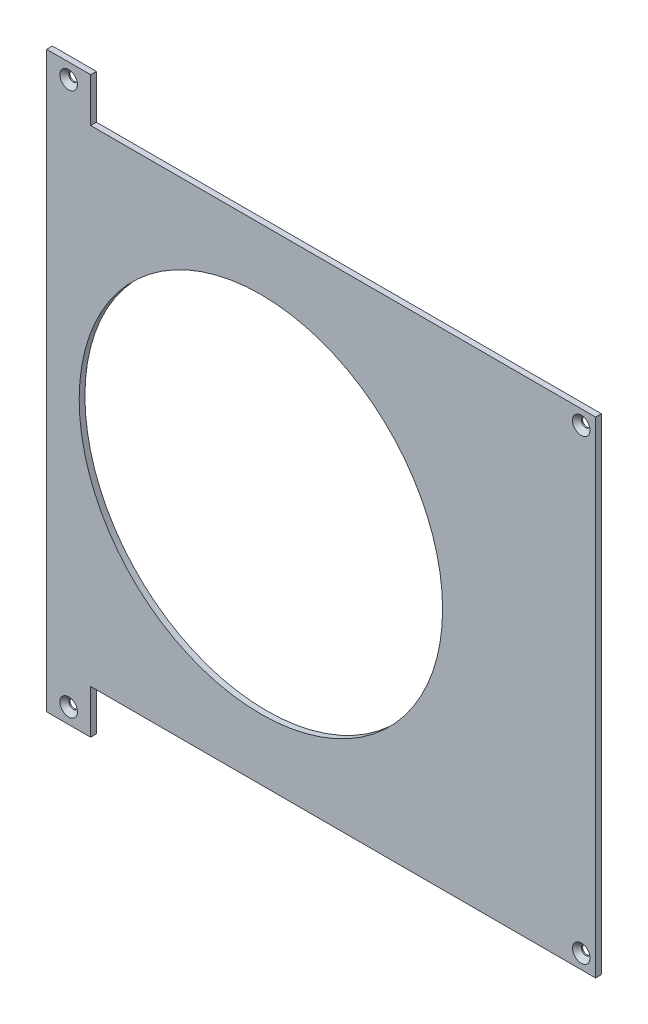
ISO-10303-21;
HEADER;
FILE_DESCRIPTION(('STEP AP214'),'2;1');
FILE_NAME('part.step','',(''),(''),'','','');
FILE_SCHEMA(('AUTOMOTIVE_DESIGN { 1 0 10303 214 1 1 1 1 }'));
ENDSEC;
DATA;
#1=APPLICATION_CONTEXT('core data for automotive mechanical design processes');
#2=APPLICATION_PROTOCOL_DEFINITION('international standard','automotive_design',2000,#1);
#3=PRODUCT_CONTEXT('',#1,'mechanical');
#4=PRODUCT('Part','Part','',(#3));
#5=PRODUCT_RELATED_PRODUCT_CATEGORY('part','',(#4));
#6=PRODUCT_DEFINITION_FORMATION('','',#4);
#7=PRODUCT_DEFINITION_CONTEXT('part definition',#1,'design');
#8=PRODUCT_DEFINITION('design','',#6,#7);
#9=PRODUCT_DEFINITION_SHAPE('','',#8);
#10=(LENGTH_UNIT() NAMED_UNIT(*) SI_UNIT(.MILLI.,.METRE.));
#11=(NAMED_UNIT(*) PLANE_ANGLE_UNIT() SI_UNIT($,.RADIAN.));
#12=(NAMED_UNIT(*) SI_UNIT($,.STERADIAN.) SOLID_ANGLE_UNIT());
#13=UNCERTAINTY_MEASURE_WITH_UNIT(LENGTH_MEASURE(1.E-05),#10,'distance_accuracy_value','');
#14=(GEOMETRIC_REPRESENTATION_CONTEXT(3) GLOBAL_UNCERTAINTY_ASSIGNED_CONTEXT((#13)) GLOBAL_UNIT_ASSIGNED_CONTEXT((#10,
#11,#12)) REPRESENTATION_CONTEXT('',''));
#15=CARTESIAN_POINT('',(0.,0.,0.));
#16=DIRECTION('',(0.,0.,1.));
#17=DIRECTION('',(1.,0.,0.));
#18=AXIS2_PLACEMENT_3D('',#15,#16,#17);
#19=CARTESIAN_POINT('',(38.0007499908043,-23.0000000000001,3.));
#20=DIRECTION('',(-1.,0.,0.));
#21=DIRECTION('',(0.,0.,1.));
#22=AXIS2_PLACEMENT_3D('',#19,#20,#21);
#23=PLANE('',#22);
#24=DIRECTION('',(0.,1.,0.));
#25=VECTOR('',#24,1.);
#26=CARTESIAN_POINT('',(38.0007499908043,-23.0000000000001,0.));
#27=LINE('',#26,#25);
#28=CARTESIAN_POINT('',(38.0007499908043,-23.0000000000001,0.));
#29=VERTEX_POINT('',#28);
#30=CARTESIAN_POINT('',(38.0007499908043,0.,0.));
#31=VERTEX_POINT('',#30);
#32=EDGE_CURVE('E148',#29,#31,#27,.T.);
#33=ORIENTED_EDGE('',*,*,#32,.T.);
#34=DIRECTION('',(0.,0.,-1.));
#35=VECTOR('',#34,1.);
#36=CARTESIAN_POINT('',(38.0007499908043,0.,3.));
#37=LINE('',#36,#35);
#38=CARTESIAN_POINT('',(38.0007499908043,0.,3.));
#39=VERTEX_POINT('',#38);
#40=EDGE_CURVE('E11',#39,#31,#37,.T.);
#41=ORIENTED_EDGE('',*,*,#40,.F.);
#42=DIRECTION('',(0.,1.,0.));
#43=VECTOR('',#42,1.);
#44=CARTESIAN_POINT('',(38.0007499908043,-23.0000000000001,3.));
#45=LINE('',#44,#43);
#46=CARTESIAN_POINT('',(38.0007499908043,-23.0000000000001,3.));
#47=VERTEX_POINT('',#46);
#48=EDGE_CURVE('E174',#47,#39,#45,.T.);
#49=ORIENTED_EDGE('',*,*,#48,.F.);
#50=DIRECTION('',(0.,0.,-1.));
#51=VECTOR('',#50,1.);
#52=CARTESIAN_POINT('',(38.0007499908043,-23.0000000000001,3.));
#53=LINE('',#52,#51);
#54=EDGE_CURVE('E61',#47,#29,#53,.T.);
#55=ORIENTED_EDGE('',*,*,#54,.T.);
#56=EDGE_LOOP('',(#33,#41,#49,#55));
#57=FACE_BOUND('',#56,.T.);
#58=ADVANCED_FACE('F43',(#57),#23,.F.);
#59=CARTESIAN_POINT('',(38.0007499908043,0.,3.));
#60=DIRECTION('',(0.,-1.,0.));
#61=DIRECTION('',(1.,0.,0.));
#62=AXIS2_PLACEMENT_3D('',#59,#60,#61);
#63=PLANE('',#62);
#64=DIRECTION('',(-1.,0.,0.));
#65=VECTOR('',#64,1.);
#66=CARTESIAN_POINT('',(38.0007499908043,0.,0.));
#67=LINE('',#66,#65);
#68=CARTESIAN_POINT('',(15.0007499908043,0.,0.));
#69=VERTEX_POINT('',#68);
#70=EDGE_CURVE('E151',#31,#69,#67,.T.);
#71=ORIENTED_EDGE('',*,*,#70,.T.);
#72=DIRECTION('',(0.,0.,-1.));
#73=VECTOR('',#72,1.);
#74=CARTESIAN_POINT('',(15.0007499908043,0.,3.));
#75=LINE('',#74,#73);
#76=CARTESIAN_POINT('',(15.0007499908043,0.,3.));
#77=VERTEX_POINT('',#76);
#78=EDGE_CURVE('E53',#77,#69,#75,.T.);
#79=ORIENTED_EDGE('',*,*,#78,.F.);
#80=DIRECTION('',(-1.,0.,0.));
#81=VECTOR('',#80,1.);
#82=CARTESIAN_POINT('',(38.0007499908043,0.,3.));
#83=LINE('',#82,#81);
#84=EDGE_CURVE('E100',#39,#77,#83,.T.);
#85=ORIENTED_EDGE('',*,*,#84,.F.);
#86=ORIENTED_EDGE('',*,*,#40,.T.);
#87=EDGE_LOOP('',(#71,#79,#85,#86));
#88=FACE_BOUND('',#87,.T.);
#89=ADVANCED_FACE('F219',(#88),#63,.F.);
#90=CARTESIAN_POINT('',(15.0007499908043,0.,3.));
#91=DIRECTION('',(1.,0.,0.));
#92=DIRECTION('',(0.,0.,-1.));
#93=AXIS2_PLACEMENT_3D('',#90,#91,#92);
#94=PLANE('',#93);
#95=DIRECTION('',(0.,-1.,0.));
#96=VECTOR('',#95,1.);
#97=CARTESIAN_POINT('',(15.0007499908043,0.,0.));
#98=LINE('',#97,#96);
#99=CARTESIAN_POINT('',(15.0007499908043,-300.,0.));
#100=VERTEX_POINT('',#99);
#101=EDGE_CURVE('E155',#69,#100,#98,.T.);
#102=ORIENTED_EDGE('',*,*,#101,.T.);
#103=DIRECTION('',(0.,0.,-1.));
#104=VECTOR('',#103,1.);
#105=CARTESIAN_POINT('',(15.0007499908043,-300.,3.));
#106=LINE('',#105,#104);
#107=CARTESIAN_POINT('',(15.0007499908043,-300.,3.));
#108=VERTEX_POINT('',#107);
#109=EDGE_CURVE('E185',#108,#100,#106,.T.);
#110=ORIENTED_EDGE('',*,*,#109,.F.);
#111=DIRECTION('',(0.,-1.,0.));
#112=VECTOR('',#111,1.);
#113=CARTESIAN_POINT('',(15.0007499908043,0.,3.));
#114=LINE('',#113,#112);
#115=EDGE_CURVE('E196',#77,#108,#114,.T.);
#116=ORIENTED_EDGE('',*,*,#115,.F.);
#117=ORIENTED_EDGE('',*,*,#78,.T.);
#118=EDGE_LOOP('',(#102,#110,#116,#117));
#119=FACE_BOUND('',#118,.T.);
#120=ADVANCED_FACE('F194',(#119),#94,.F.);
#121=CARTESIAN_POINT('',(15.0007499908043,-300.,3.));
#122=DIRECTION('',(0.,1.,0.));
#123=DIRECTION('',(0.,0.,1.));
#124=AXIS2_PLACEMENT_3D('',#121,#122,#123);
#125=PLANE('',#124);
#126=DIRECTION('',(1.,0.,0.));
#127=VECTOR('',#126,1.);
#128=CARTESIAN_POINT('',(15.0007499908043,-300.,0.));
#129=LINE('',#128,#127);
#130=CARTESIAN_POINT('',(38.0007499908043,-300.,0.));
#131=VERTEX_POINT('',#130);
#132=EDGE_CURVE('E158',#100,#131,#129,.T.);
#133=ORIENTED_EDGE('',*,*,#132,.T.);
#134=DIRECTION('',(0.,0.,-1.));
#135=VECTOR('',#134,1.);
#136=CARTESIAN_POINT('',(38.0007499908043,-300.,3.));
#137=LINE('',#136,#135);
#138=CARTESIAN_POINT('',(38.0007499908043,-300.,3.));
#139=VERTEX_POINT('',#138);
#140=EDGE_CURVE('E181',#139,#131,#137,.T.);
#141=ORIENTED_EDGE('',*,*,#140,.F.);
#142=DIRECTION('',(1.,0.,0.));
#143=VECTOR('',#142,1.);
#144=CARTESIAN_POINT('',(15.0007499908043,-300.,3.));
#145=LINE('',#144,#143);
#146=EDGE_CURVE('E142',#108,#139,#145,.T.);
#147=ORIENTED_EDGE('',*,*,#146,.F.);
#148=ORIENTED_EDGE('',*,*,#109,.T.);
#149=EDGE_LOOP('',(#133,#141,#147,#148));
#150=FACE_BOUND('',#149,.T.);
#151=ADVANCED_FACE('F203',(#150),#125,.F.);
#152=CARTESIAN_POINT('',(38.0007499908043,-300.,3.));
#153=DIRECTION('',(-1.,0.,0.));
#154=DIRECTION('',(0.,0.,1.));
#155=AXIS2_PLACEMENT_3D('',#152,#153,#154);
#156=PLANE('',#155);
#157=DIRECTION('',(0.,1.,0.));
#158=VECTOR('',#157,1.);
#159=CARTESIAN_POINT('',(38.0007499908043,-300.,0.));
#160=LINE('',#159,#158);
#161=CARTESIAN_POINT('',(38.0007499908043,-277.,0.));
#162=VERTEX_POINT('',#161);
#163=EDGE_CURVE('E161',#131,#162,#160,.T.);
#164=ORIENTED_EDGE('',*,*,#163,.T.);
#165=DIRECTION('',(0.,0.,-1.));
#166=VECTOR('',#165,1.);
#167=CARTESIAN_POINT('',(38.0007499908043,-277.,3.));
#168=LINE('',#167,#166);
#169=CARTESIAN_POINT('',(38.0007499908043,-277.,3.));
#170=VERTEX_POINT('',#169);
#171=EDGE_CURVE('E126',#170,#162,#168,.T.);
#172=ORIENTED_EDGE('',*,*,#171,.F.);
#173=DIRECTION('',(0.,1.,0.));
#174=VECTOR('',#173,1.);
#175=CARTESIAN_POINT('',(38.0007499908043,-300.,3.));
#176=LINE('',#175,#174);
#177=EDGE_CURVE('E137',#139,#170,#176,.T.);
#178=ORIENTED_EDGE('',*,*,#177,.F.);
#179=ORIENTED_EDGE('',*,*,#140,.T.);
#180=EDGE_LOOP('',(#164,#172,#178,#179));
#181=FACE_BOUND('',#180,.T.);
#182=ADVANCED_FACE('F206',(#181),#156,.F.);
#183=CARTESIAN_POINT('',(302.000749990804,-277.,3.));
#184=DIRECTION('',(0.,-1.,0.));
#185=DIRECTION('',(0.,0.,-1.));
#186=AXIS2_PLACEMENT_3D('',#183,#184,#185);
#187=PLANE('',#186);
#188=DIRECTION('',(-1.,0.,0.));
#189=VECTOR('',#188,1.);
#190=CARTESIAN_POINT('',(302.000749990804,-277.,0.));
#191=LINE('',#190,#189);
#192=CARTESIAN_POINT('',(302.000749990804,-277.,0.));
#193=VERTEX_POINT('',#192);
#194=EDGE_CURVE('E122',#193,#162,#191,.T.);
#195=ORIENTED_EDGE('',*,*,#194,.F.);
#196=DIRECTION('',(0.,0.,-1.));
#197=VECTOR('',#196,1.);
#198=CARTESIAN_POINT('',(302.000749990804,-277.,3.));
#199=LINE('',#198,#197);
#200=CARTESIAN_POINT('',(302.000749990804,-277.,3.));
#201=VERTEX_POINT('',#200);
#202=EDGE_CURVE('E116',#201,#193,#199,.T.);
#203=ORIENTED_EDGE('',*,*,#202,.F.);
#204=DIRECTION('',(-1.,0.,0.));
#205=VECTOR('',#204,1.);
#206=CARTESIAN_POINT('',(302.000749990804,-277.,3.));
#207=LINE('',#206,#205);
#208=EDGE_CURVE('E120',#201,#170,#207,.T.);
#209=ORIENTED_EDGE('',*,*,#208,.T.);
#210=ORIENTED_EDGE('',*,*,#171,.T.);
#211=EDGE_LOOP('',(#195,#203,#209,#210));
#212=FACE_BOUND('',#211,.T.);
#213=ADVANCED_FACE('F118',(#212),#187,.T.);
#214=CARTESIAN_POINT('',(302.000749990804,-277.,3.));
#215=DIRECTION('',(-1.,0.,0.));
#216=DIRECTION('',(0.,0.,1.));
#217=AXIS2_PLACEMENT_3D('',#214,#215,#216);
#218=PLANE('',#217);
#219=DIRECTION('',(0.,1.,0.));
#220=VECTOR('',#219,1.);
#221=CARTESIAN_POINT('',(302.000749990804,-277.,0.));
#222=LINE('',#221,#220);
#223=CARTESIAN_POINT('',(302.000749990804,-23.0000000000001,0.));
#224=VERTEX_POINT('',#223);
#225=EDGE_CURVE('E167',#193,#224,#222,.T.);
#226=ORIENTED_EDGE('',*,*,#225,.T.);
#227=DIRECTION('',(0.,0.,-1.));
#228=VECTOR('',#227,1.);
#229=CARTESIAN_POINT('',(302.000749990804,-23.0000000000001,3.));
#230=LINE('',#229,#228);
#231=CARTESIAN_POINT('',(302.000749990804,-23.0000000000001,3.));
#232=VERTEX_POINT('',#231);
#233=EDGE_CURVE('E88',#232,#224,#230,.T.);
#234=ORIENTED_EDGE('',*,*,#233,.F.);
#235=DIRECTION('',(0.,1.,0.));
#236=VECTOR('',#235,1.);
#237=CARTESIAN_POINT('',(302.000749990804,-277.,3.));
#238=LINE('',#237,#236);
#239=EDGE_CURVE('E128',#201,#232,#238,.T.);
#240=ORIENTED_EDGE('',*,*,#239,.F.);
#241=ORIENTED_EDGE('',*,*,#202,.T.);
#242=EDGE_LOOP('',(#226,#234,#240,#241));
#243=FACE_BOUND('',#242,.T.);
#244=ADVANCED_FACE('F129',(#243),#218,.F.);
#245=CARTESIAN_POINT('',(38.0007499908043,-23.0000000000001,3.));
#246=DIRECTION('',(0.,1.,0.));
#247=DIRECTION('',(-1.,0.,0.));
#248=AXIS2_PLACEMENT_3D('',#245,#246,#247);
#249=PLANE('',#248);
#250=DIRECTION('',(1.,0.,0.));
#251=VECTOR('',#250,1.);
#252=CARTESIAN_POINT('',(38.0007499908043,-23.0000000000001,0.));
#253=LINE('',#252,#251);
#254=EDGE_CURVE('E170',#29,#224,#253,.T.);
#255=ORIENTED_EDGE('',*,*,#254,.F.);
#256=ORIENTED_EDGE('',*,*,#54,.F.);
#257=DIRECTION('',(1.,0.,0.));
#258=VECTOR('',#257,1.);
#259=CARTESIAN_POINT('',(38.0007499908043,-23.0000000000001,3.));
#260=LINE('',#259,#258);
#261=EDGE_CURVE('E133',#47,#232,#260,.T.);
#262=ORIENTED_EDGE('',*,*,#261,.T.);
#263=ORIENTED_EDGE('',*,*,#233,.T.);
#264=EDGE_LOOP('',(#255,#256,#262,#263));
#265=FACE_BOUND('',#264,.T.);
#266=ADVANCED_FACE('F207',(#265),#249,.T.);
#267=CARTESIAN_POINT('',(0.,0.,3.));
#268=DIRECTION('',(0.,0.,1.));
#269=DIRECTION('',(1.,0.,0.));
#270=AXIS2_PLACEMENT_3D('',#267,#268,#269);
#271=PLANE('',#270);
#272=CARTESIAN_POINT('',(127.000749990804,-150.,3.));
#273=DIRECTION('',(0.,0.,1.));
#274=DIRECTION('',(1.,0.,0.));
#275=AXIS2_PLACEMENT_3D('',#272,#273,#274);
#276=CIRCLE('',#275,95.);
#277=CARTESIAN_POINT('',(222.000749990804,-150.,3.));
#278=VERTEX_POINT('',#277);
#279=EDGE_CURVE('E279',#278,#278,#276,.T.);
#280=ORIENTED_EDGE('',*,*,#279,.F.);
#281=EDGE_LOOP('',(#280));
#282=FACE_BOUND('',#281,.T.);
#283=CARTESIAN_POINT('',(26.5007499908043,-8.00000000000006,3.));
#284=DIRECTION('',(0.,0.,1.));
#285=DIRECTION('',(1.,0.,0.));
#286=AXIS2_PLACEMENT_3D('',#283,#284,#285);
#287=CIRCLE('',#286,4.59);
#288=CARTESIAN_POINT('',(31.0907499908043,-8.00000000000006,3.));
#289=VERTEX_POINT('',#288);
#290=EDGE_CURVE('E275',#289,#289,#287,.T.);
#291=ORIENTED_EDGE('',*,*,#290,.F.);
#292=EDGE_LOOP('',(#291));
#293=FACE_BOUND('',#292,.T.);
#294=CARTESIAN_POINT('',(26.5007499908043,-292.,3.));
#295=DIRECTION('',(0.,0.,1.));
#296=DIRECTION('',(1.,0.,0.));
#297=AXIS2_PLACEMENT_3D('',#294,#295,#296);
#298=CIRCLE('',#297,4.59);
#299=CARTESIAN_POINT('',(31.0907499908043,-292.,3.));
#300=VERTEX_POINT('',#299);
#301=EDGE_CURVE('E263',#300,#300,#298,.T.);
#302=ORIENTED_EDGE('',*,*,#301,.F.);
#303=EDGE_LOOP('',(#302));
#304=FACE_BOUND('',#303,.T.);
#305=CARTESIAN_POINT('',(294.500749990804,-30.5000000000001,3.));
#306=DIRECTION('',(0.,0.,1.));
#307=DIRECTION('',(1.,0.,0.));
#308=AXIS2_PLACEMENT_3D('',#305,#306,#307);
#309=CIRCLE('',#308,4.58999999999998);
#310=CARTESIAN_POINT('',(299.090749990804,-30.5000000000001,3.));
#311=VERTEX_POINT('',#310);
#312=EDGE_CURVE('E251',#311,#311,#309,.T.);
#313=ORIENTED_EDGE('',*,*,#312,.F.);
#314=EDGE_LOOP('',(#313));
#315=FACE_BOUND('',#314,.T.);
#316=CARTESIAN_POINT('',(294.500749990804,-269.5,3.));
#317=DIRECTION('',(0.,0.,1.));
#318=DIRECTION('',(1.,0.,0.));
#319=AXIS2_PLACEMENT_3D('',#316,#317,#318);
#320=CIRCLE('',#319,4.58999999999998);
#321=CARTESIAN_POINT('',(299.090749990804,-269.5,3.));
#322=VERTEX_POINT('',#321);
#323=EDGE_CURVE('E239',#322,#322,#320,.T.);
#324=ORIENTED_EDGE('',*,*,#323,.F.);
#325=EDGE_LOOP('',(#324));
#326=FACE_BOUND('',#325,.T.);
#327=ORIENTED_EDGE('',*,*,#48,.T.);
#328=ORIENTED_EDGE('',*,*,#84,.T.);
#329=ORIENTED_EDGE('',*,*,#115,.T.);
#330=ORIENTED_EDGE('',*,*,#146,.T.);
#331=ORIENTED_EDGE('',*,*,#177,.T.);
#332=ORIENTED_EDGE('',*,*,#208,.F.);
#333=ORIENTED_EDGE('',*,*,#239,.T.);
#334=ORIENTED_EDGE('',*,*,#261,.F.);
#335=EDGE_LOOP('',(#327,#328,#329,#330,#331,#332,#333,#334));
#336=FACE_BOUND('',#335,.T.);
#337=ADVANCED_FACE('F135',(#282,#293,#304,#315,#326,#336),#271,.T.);
#338=CARTESIAN_POINT('',(0.,0.,0.));
#339=DIRECTION('',(0.,0.,1.));
#340=DIRECTION('',(1.,0.,0.));
#341=AXIS2_PLACEMENT_3D('',#338,#339,#340);
#342=PLANE('',#341);
#343=CARTESIAN_POINT('',(127.000749990804,-150.,0.));
#344=DIRECTION('',(0.,0.,1.));
#345=DIRECTION('',(1.,0.,0.));
#346=AXIS2_PLACEMENT_3D('',#343,#344,#345);
#347=CIRCLE('',#346,95.);
#348=CARTESIAN_POINT('',(222.000749990804,-150.,0.));
#349=VERTEX_POINT('',#348);
#350=EDGE_CURVE('E46',#349,#349,#347,.T.);
#351=ORIENTED_EDGE('',*,*,#350,.T.);
#352=EDGE_LOOP('',(#351));
#353=FACE_BOUND('',#352,.T.);
#354=CARTESIAN_POINT('',(26.5007499908043,-8.00000000000006,0.));
#355=DIRECTION('',(0.,0.,1.));
#356=DIRECTION('',(1.,0.,0.));
#357=AXIS2_PLACEMENT_3D('',#354,#355,#356);
#358=CIRCLE('',#357,2.25);
#359=CARTESIAN_POINT('',(28.7507499908043,-8.00000000000006,0.));
#360=VERTEX_POINT('',#359);
#361=EDGE_CURVE('E267',#360,#360,#358,.T.);
#362=ORIENTED_EDGE('',*,*,#361,.T.);
#363=EDGE_LOOP('',(#362));
#364=FACE_BOUND('',#363,.T.);
#365=CARTESIAN_POINT('',(26.5007499908043,-292.,0.));
#366=DIRECTION('',(0.,0.,1.));
#367=DIRECTION('',(1.,0.,0.));
#368=AXIS2_PLACEMENT_3D('',#365,#366,#367);
#369=CIRCLE('',#368,2.25);
#370=CARTESIAN_POINT('',(28.7507499908043,-292.,0.));
#371=VERTEX_POINT('',#370);
#372=EDGE_CURVE('E255',#371,#371,#369,.T.);
#373=ORIENTED_EDGE('',*,*,#372,.T.);
#374=EDGE_LOOP('',(#373));
#375=FACE_BOUND('',#374,.T.);
#376=CARTESIAN_POINT('',(294.500749990804,-30.5000000000001,0.));
#377=DIRECTION('',(0.,0.,1.));
#378=DIRECTION('',(1.,0.,0.));
#379=AXIS2_PLACEMENT_3D('',#376,#377,#378);
#380=CIRCLE('',#379,2.24999999999997);
#381=CARTESIAN_POINT('',(296.750749990804,-30.5000000000001,0.));
#382=VERTEX_POINT('',#381);
#383=EDGE_CURVE('E243',#382,#382,#380,.T.);
#384=ORIENTED_EDGE('',*,*,#383,.T.);
#385=EDGE_LOOP('',(#384));
#386=FACE_BOUND('',#385,.T.);
#387=CARTESIAN_POINT('',(294.500749990804,-269.5,0.));
#388=DIRECTION('',(0.,0.,1.));
#389=DIRECTION('',(1.,0.,0.));
#390=AXIS2_PLACEMENT_3D('',#387,#388,#389);
#391=CIRCLE('',#390,2.24999999999997);
#392=CARTESIAN_POINT('',(296.750749990804,-269.5,0.));
#393=VERTEX_POINT('',#392);
#394=EDGE_CURVE('E152',#393,#393,#391,.T.);
#395=ORIENTED_EDGE('',*,*,#394,.T.);
#396=EDGE_LOOP('',(#395));
#397=FACE_BOUND('',#396,.T.);
#398=ORIENTED_EDGE('',*,*,#32,.F.);
#399=ORIENTED_EDGE('',*,*,#254,.T.);
#400=ORIENTED_EDGE('',*,*,#225,.F.);
#401=ORIENTED_EDGE('',*,*,#194,.T.);
#402=ORIENTED_EDGE('',*,*,#163,.F.);
#403=ORIENTED_EDGE('',*,*,#132,.F.);
#404=ORIENTED_EDGE('',*,*,#101,.F.);
#405=ORIENTED_EDGE('',*,*,#70,.F.);
#406=EDGE_LOOP('',(#398,#399,#400,#401,#402,#403,#404,#405));
#407=FACE_BOUND('',#406,.T.);
#408=ADVANCED_FACE('F199',(#353,#364,#375,#386,#397,#407),#342,.F.);
#409=CARTESIAN_POINT('',(294.500749990804,-269.5,3.));
#410=DIRECTION('',(0.,0.,1.));
#411=DIRECTION('',(1.,0.,0.));
#412=AXIS2_PLACEMENT_3D('',#409,#410,#411);
#413=CYLINDRICAL_SURFACE('',#412,2.24999999999997);
#414=ORIENTED_EDGE('',*,*,#394,.F.);
#415=EDGE_LOOP('',(#414));
#416=FACE_BOUND('',#415,.T.);
#417=CARTESIAN_POINT('',(294.500749990804,-269.5,0.660000000000001));
#418=DIRECTION('',(0.,0.,1.));
#419=DIRECTION('',(1.,0.,0.));
#420=AXIS2_PLACEMENT_3D('',#417,#418,#419);
#421=CIRCLE('',#420,2.24999999999997);
#422=CARTESIAN_POINT('',(296.750749990804,-269.5,0.660000000000001));
#423=VERTEX_POINT('',#422);
#424=EDGE_CURVE('E235',#423,#423,#421,.T.);
#425=ORIENTED_EDGE('',*,*,#424,.T.);
#426=EDGE_LOOP('',(#425));
#427=FACE_BOUND('',#426,.T.);
#428=ADVANCED_FACE('F323',(#416,#427),#413,.F.);
#429=CARTESIAN_POINT('',(294.500749990804,-269.5,3.));
#430=DIRECTION('',(0.,0.,1.));
#431=DIRECTION('',(1.,0.,0.));
#432=AXIS2_PLACEMENT_3D('',#429,#430,#431);
#433=CONICAL_SURFACE('',#432,4.58999999999998,0.78539816339745);
#434=ORIENTED_EDGE('',*,*,#424,.F.);
#435=EDGE_LOOP('',(#434));
#436=FACE_BOUND('',#435,.T.);
#437=ORIENTED_EDGE('',*,*,#323,.T.);
#438=EDGE_LOOP('',(#437));
#439=FACE_BOUND('',#438,.T.);
#440=ADVANCED_FACE('F319',(#436,#439),#433,.F.);
#441=CARTESIAN_POINT('',(294.500749990804,-30.5000000000001,3.));
#442=DIRECTION('',(0.,0.,1.));
#443=DIRECTION('',(1.,0.,0.));
#444=AXIS2_PLACEMENT_3D('',#441,#442,#443);
#445=CYLINDRICAL_SURFACE('',#444,2.24999999999997);
#446=ORIENTED_EDGE('',*,*,#383,.F.);
#447=EDGE_LOOP('',(#446));
#448=FACE_BOUND('',#447,.T.);
#449=CARTESIAN_POINT('',(294.500749990804,-30.5000000000001,0.660000000000001));
#450=DIRECTION('',(0.,0.,1.));
#451=DIRECTION('',(1.,0.,0.));
#452=AXIS2_PLACEMENT_3D('',#449,#450,#451);
#453=CIRCLE('',#452,2.24999999999997);
#454=CARTESIAN_POINT('',(296.750749990804,-30.5000000000001,0.660000000000001));
#455=VERTEX_POINT('',#454);
#456=EDGE_CURVE('E247',#455,#455,#453,.T.);
#457=ORIENTED_EDGE('',*,*,#456,.T.);
#458=EDGE_LOOP('',(#457));
#459=FACE_BOUND('',#458,.T.);
#460=ADVANCED_FACE('F315',(#448,#459),#445,.F.);
#461=CARTESIAN_POINT('',(294.500749990804,-30.5000000000001,3.));
#462=DIRECTION('',(0.,0.,1.));
#463=DIRECTION('',(1.,0.,0.));
#464=AXIS2_PLACEMENT_3D('',#461,#462,#463);
#465=CONICAL_SURFACE('',#464,4.58999999999998,0.78539816339745);
#466=ORIENTED_EDGE('',*,*,#456,.F.);
#467=EDGE_LOOP('',(#466));
#468=FACE_BOUND('',#467,.T.);
#469=ORIENTED_EDGE('',*,*,#312,.T.);
#470=EDGE_LOOP('',(#469));
#471=FACE_BOUND('',#470,.T.);
#472=ADVANCED_FACE('F311',(#468,#471),#465,.F.);
#473=CARTESIAN_POINT('',(26.5007499908043,-292.,3.));
#474=DIRECTION('',(0.,0.,1.));
#475=DIRECTION('',(1.,0.,0.));
#476=AXIS2_PLACEMENT_3D('',#473,#474,#475);
#477=CYLINDRICAL_SURFACE('',#476,2.25);
#478=ORIENTED_EDGE('',*,*,#372,.F.);
#479=EDGE_LOOP('',(#478));
#480=FACE_BOUND('',#479,.T.);
#481=CARTESIAN_POINT('',(26.5007499908043,-292.,0.660000000000001));
#482=DIRECTION('',(0.,0.,1.));
#483=DIRECTION('',(1.,0.,0.));
#484=AXIS2_PLACEMENT_3D('',#481,#482,#483);
#485=CIRCLE('',#484,2.25);
#486=CARTESIAN_POINT('',(28.7507499908043,-292.,0.660000000000001));
#487=VERTEX_POINT('',#486);
#488=EDGE_CURVE('E259',#487,#487,#485,.T.);
#489=ORIENTED_EDGE('',*,*,#488,.T.);
#490=EDGE_LOOP('',(#489));
#491=FACE_BOUND('',#490,.T.);
#492=ADVANCED_FACE('F307',(#480,#491),#477,.F.);
#493=CARTESIAN_POINT('',(26.5007499908043,-292.,3.));
#494=DIRECTION('',(0.,0.,1.));
#495=DIRECTION('',(1.,0.,0.));
#496=AXIS2_PLACEMENT_3D('',#493,#494,#495);
#497=CONICAL_SURFACE('',#496,4.59,0.785398163397448);
#498=ORIENTED_EDGE('',*,*,#488,.F.);
#499=EDGE_LOOP('',(#498));
#500=FACE_BOUND('',#499,.T.);
#501=ORIENTED_EDGE('',*,*,#301,.T.);
#502=EDGE_LOOP('',(#501));
#503=FACE_BOUND('',#502,.T.);
#504=ADVANCED_FACE('F303',(#500,#503),#497,.F.);
#505=CARTESIAN_POINT('',(26.5007499908043,-8.00000000000006,3.));
#506=DIRECTION('',(0.,0.,1.));
#507=DIRECTION('',(1.,0.,0.));
#508=AXIS2_PLACEMENT_3D('',#505,#506,#507);
#509=CYLINDRICAL_SURFACE('',#508,2.25);
#510=ORIENTED_EDGE('',*,*,#361,.F.);
#511=EDGE_LOOP('',(#510));
#512=FACE_BOUND('',#511,.T.);
#513=CARTESIAN_POINT('',(26.5007499908043,-8.00000000000006,0.660000000000001));
#514=DIRECTION('',(0.,0.,1.));
#515=DIRECTION('',(1.,0.,0.));
#516=AXIS2_PLACEMENT_3D('',#513,#514,#515);
#517=CIRCLE('',#516,2.25);
#518=CARTESIAN_POINT('',(28.7507499908043,-8.00000000000006,0.660000000000001));
#519=VERTEX_POINT('',#518);
#520=EDGE_CURVE('E271',#519,#519,#517,.T.);
#521=ORIENTED_EDGE('',*,*,#520,.T.);
#522=EDGE_LOOP('',(#521));
#523=FACE_BOUND('',#522,.T.);
#524=ADVANCED_FACE('F297',(#512,#523),#509,.F.);
#525=CARTESIAN_POINT('',(26.5007499908043,-8.00000000000006,3.));
#526=DIRECTION('',(0.,0.,1.));
#527=DIRECTION('',(1.,0.,0.));
#528=AXIS2_PLACEMENT_3D('',#525,#526,#527);
#529=CONICAL_SURFACE('',#528,4.59,0.785398163397448);
#530=ORIENTED_EDGE('',*,*,#520,.F.);
#531=EDGE_LOOP('',(#530));
#532=FACE_BOUND('',#531,.T.);
#533=ORIENTED_EDGE('',*,*,#290,.T.);
#534=EDGE_LOOP('',(#533));
#535=FACE_BOUND('',#534,.T.);
#536=ADVANCED_FACE('F292',(#532,#535),#529,.F.);
#537=CARTESIAN_POINT('',(127.000749990804,-150.,-7.));
#538=DIRECTION('',(0.,0.,1.));
#539=DIRECTION('',(1.,0.,0.));
#540=AXIS2_PLACEMENT_3D('',#537,#538,#539);
#541=CYLINDRICAL_SURFACE('',#540,95.);
#542=ORIENTED_EDGE('',*,*,#279,.T.);
#543=EDGE_LOOP('',(#542));
#544=FACE_BOUND('',#543,.T.);
#545=ORIENTED_EDGE('',*,*,#350,.F.);
#546=EDGE_LOOP('',(#545));
#547=FACE_BOUND('',#546,.T.);
#548=ADVANCED_FACE('F290',(#544,#547),#541,.F.);
#549=CLOSED_SHELL('',(#58,#89,#120,#151,#182,#213,#244,#266,#337,#408,#428,#440,#460,#472,#492,
#504,#524,#536,#548));
#550=MANIFOLD_SOLID_BREP('B2',#549);
#551=ADVANCED_BREP_SHAPE_REPRESENTATION('',(#18,#550),#14);
#552=SHAPE_DEFINITION_REPRESENTATION(#9,#551);
ENDSEC;
END-ISO-10303-21;
